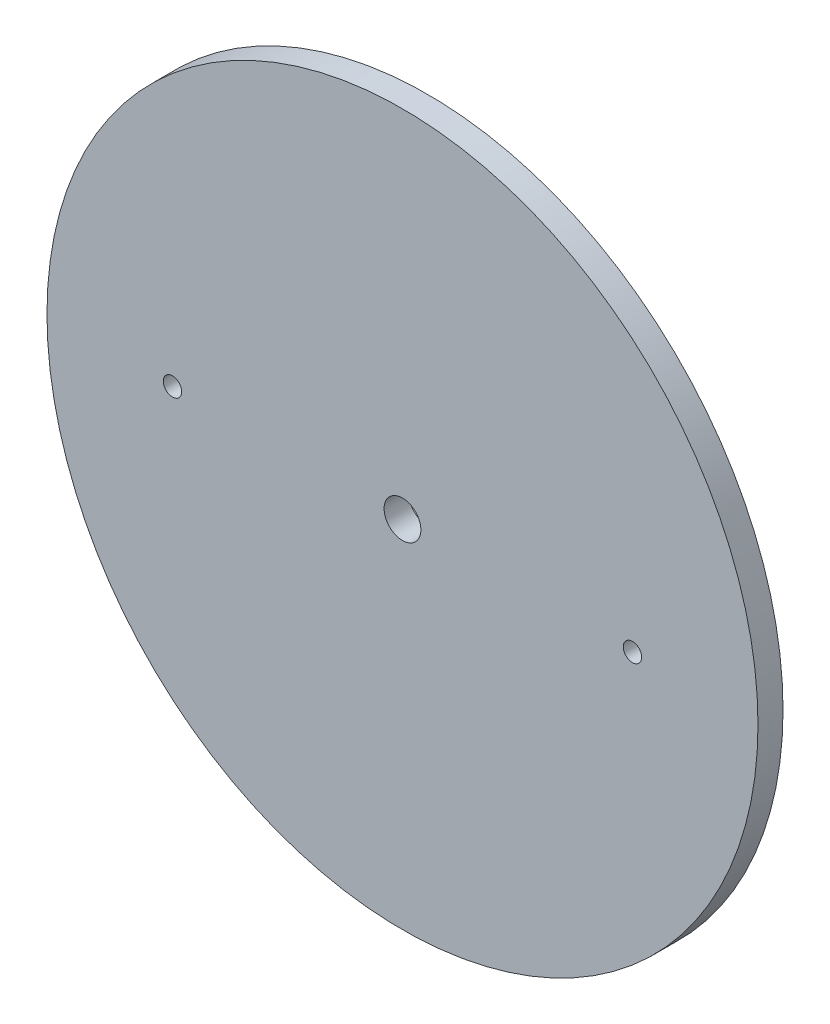
ISO-10303-21;
HEADER;
FILE_DESCRIPTION(('STEP AP214'),'2;1');
FILE_NAME('part.step','',(''),(''),'','','');
FILE_SCHEMA(('AUTOMOTIVE_DESIGN { 1 0 10303 214 1 1 1 1 }'));
ENDSEC;
DATA;
#1=APPLICATION_CONTEXT('core data for automotive mechanical design processes');
#2=APPLICATION_PROTOCOL_DEFINITION('international standard','automotive_design',2000,#1);
#3=PRODUCT_CONTEXT('',#1,'mechanical');
#4=PRODUCT('Part','Part','',(#3));
#5=PRODUCT_RELATED_PRODUCT_CATEGORY('part','',(#4));
#6=PRODUCT_DEFINITION_FORMATION('','',#4);
#7=PRODUCT_DEFINITION_CONTEXT('part definition',#1,'design');
#8=PRODUCT_DEFINITION('design','',#6,#7);
#9=PRODUCT_DEFINITION_SHAPE('','',#8);
#10=(LENGTH_UNIT() NAMED_UNIT(*) SI_UNIT(.MILLI.,.METRE.));
#11=(NAMED_UNIT(*) PLANE_ANGLE_UNIT() SI_UNIT($,.RADIAN.));
#12=(NAMED_UNIT(*) SI_UNIT($,.STERADIAN.) SOLID_ANGLE_UNIT());
#13=UNCERTAINTY_MEASURE_WITH_UNIT(LENGTH_MEASURE(1.E-05),#10,'distance_accuracy_value','');
#14=(GEOMETRIC_REPRESENTATION_CONTEXT(3) GLOBAL_UNCERTAINTY_ASSIGNED_CONTEXT((#13)) GLOBAL_UNIT_ASSIGNED_CONTEXT((#10,
#11,#12)) REPRESENTATION_CONTEXT('',''));
#15=CARTESIAN_POINT('',(0.,0.,0.));
#16=DIRECTION('',(0.,0.,1.));
#17=DIRECTION('',(1.,0.,0.));
#18=AXIS2_PLACEMENT_3D('',#15,#16,#17);
#19=CARTESIAN_POINT('',(0.,0.,0.));
#20=DIRECTION('',(0.,0.,-1.));
#21=DIRECTION('',(-1.,0.,0.));
#22=AXIS2_PLACEMENT_3D('',#19,#20,#21);
#23=CYLINDRICAL_SURFACE('',#22,71.);
#24=CARTESIAN_POINT('',(0.,0.,0.));
#25=DIRECTION('',(0.,0.,-1.));
#26=DIRECTION('',(1.,0.,0.));
#27=AXIS2_PLACEMENT_3D('',#24,#25,#26);
#28=CIRCLE('',#27,71.);
#29=CARTESIAN_POINT('',(71.,0.,0.));
#30=VERTEX_POINT('',#29);
#31=EDGE_CURVE('E10',#30,#30,#28,.T.);
#32=ORIENTED_EDGE('',*,*,#31,.T.);
#33=EDGE_LOOP('',(#32));
#34=FACE_BOUND('',#33,.T.);
#35=CARTESIAN_POINT('',(0.,0.,-5.));
#36=DIRECTION('',(0.,0.,-1.));
#37=DIRECTION('',(1.,0.,0.));
#38=AXIS2_PLACEMENT_3D('',#35,#36,#37);
#39=CIRCLE('',#38,71.);
#40=CARTESIAN_POINT('',(71.,0.,-5.));
#41=VERTEX_POINT('',#40);
#42=EDGE_CURVE('E40',#41,#41,#39,.T.);
#43=ORIENTED_EDGE('',*,*,#42,.F.);
#44=EDGE_LOOP('',(#43));
#45=FACE_BOUND('',#44,.T.);
#46=ADVANCED_FACE('F37',(#34,#45),#23,.T.);
#47=CARTESIAN_POINT('',(0.,0.,0.));
#48=DIRECTION('',(0.,0.,1.));
#49=DIRECTION('',(1.,0.,0.));
#50=AXIS2_PLACEMENT_3D('',#47,#48,#49);
#51=PLANE('',#50);
#52=CARTESIAN_POINT('',(0.,0.,0.));
#53=DIRECTION('',(0.,0.,-1.));
#54=DIRECTION('',(1.,0.,0.));
#55=AXIS2_PLACEMENT_3D('',#52,#53,#54);
#56=CIRCLE('',#55,3.6745406824147);
#57=CARTESIAN_POINT('',(3.6745406824147,0.,0.));
#58=VERTEX_POINT('',#57);
#59=EDGE_CURVE('E63',#58,#58,#56,.T.);
#60=ORIENTED_EDGE('',*,*,#59,.T.);
#61=EDGE_LOOP('',(#60));
#62=FACE_BOUND('',#61,.T.);
#63=CARTESIAN_POINT('',(45.9317585301837,0.,0.));
#64=DIRECTION('',(0.,0.,-1.));
#65=DIRECTION('',(1.,0.,0.));
#66=AXIS2_PLACEMENT_3D('',#63,#64,#65);
#67=CIRCLE('',#66,1.83727034120735);
#68=CARTESIAN_POINT('',(47.7690288713911,0.,0.));
#69=VERTEX_POINT('',#68);
#70=EDGE_CURVE('E55',#69,#69,#67,.T.);
#71=ORIENTED_EDGE('',*,*,#70,.T.);
#72=EDGE_LOOP('',(#71));
#73=FACE_BOUND('',#72,.T.);
#74=CARTESIAN_POINT('',(-45.9317585301837,0.,0.));
#75=DIRECTION('',(0.,0.,-1.));
#76=DIRECTION('',(1.,0.,0.));
#77=AXIS2_PLACEMENT_3D('',#74,#75,#76);
#78=CIRCLE('',#77,1.83727034120735);
#79=CARTESIAN_POINT('',(-44.0944881889764,0.,0.));
#80=VERTEX_POINT('',#79);
#81=EDGE_CURVE('E49',#80,#80,#78,.T.);
#82=ORIENTED_EDGE('',*,*,#81,.T.);
#83=EDGE_LOOP('',(#82));
#84=FACE_BOUND('',#83,.T.);
#85=ORIENTED_EDGE('',*,*,#31,.F.);
#86=EDGE_LOOP('',(#85));
#87=FACE_BOUND('',#86,.T.);
#88=ADVANCED_FACE('F75',(#62,#73,#84,#87),#51,.T.);
#89=CARTESIAN_POINT('',(0.,0.,-5.));
#90=DIRECTION('',(0.,0.,1.));
#91=DIRECTION('',(1.,0.,0.));
#92=AXIS2_PLACEMENT_3D('',#89,#90,#91);
#93=PLANE('',#92);
#94=CARTESIAN_POINT('',(0.,0.,-5.));
#95=DIRECTION('',(0.,0.,-1.));
#96=DIRECTION('',(1.,0.,0.));
#97=AXIS2_PLACEMENT_3D('',#94,#95,#96);
#98=CIRCLE('',#97,3.6745406824147);
#99=CARTESIAN_POINT('',(3.6745406824147,0.,-5.));
#100=VERTEX_POINT('',#99);
#101=EDGE_CURVE('E67',#100,#100,#98,.T.);
#102=ORIENTED_EDGE('',*,*,#101,.F.);
#103=EDGE_LOOP('',(#102));
#104=FACE_BOUND('',#103,.T.);
#105=CARTESIAN_POINT('',(45.9317585301837,0.,-5.));
#106=DIRECTION('',(0.,0.,-1.));
#107=DIRECTION('',(1.,0.,0.));
#108=AXIS2_PLACEMENT_3D('',#105,#106,#107);
#109=CIRCLE('',#108,1.83727034120735);
#110=CARTESIAN_POINT('',(47.7690288713911,0.,-5.));
#111=VERTEX_POINT('',#110);
#112=EDGE_CURVE('E59',#111,#111,#109,.T.);
#113=ORIENTED_EDGE('',*,*,#112,.F.);
#114=EDGE_LOOP('',(#113));
#115=FACE_BOUND('',#114,.T.);
#116=CARTESIAN_POINT('',(-45.9317585301837,0.,-5.));
#117=DIRECTION('',(0.,0.,-1.));
#118=DIRECTION('',(1.,0.,0.));
#119=AXIS2_PLACEMENT_3D('',#116,#117,#118);
#120=CIRCLE('',#119,1.83727034120735);
#121=CARTESIAN_POINT('',(-44.0944881889764,0.,-5.));
#122=VERTEX_POINT('',#121);
#123=EDGE_CURVE('E51',#122,#122,#120,.T.);
#124=ORIENTED_EDGE('',*,*,#123,.F.);
#125=EDGE_LOOP('',(#124));
#126=FACE_BOUND('',#125,.T.);
#127=ORIENTED_EDGE('',*,*,#42,.T.);
#128=EDGE_LOOP('',(#127));
#129=FACE_BOUND('',#128,.T.);
#130=ADVANCED_FACE('F85',(#104,#115,#126,#129),#93,.F.);
#131=CARTESIAN_POINT('',(-45.9317585301837,0.,0.));
#132=DIRECTION('',(0.,0.,-1.));
#133=DIRECTION('',(-1.,0.,0.));
#134=AXIS2_PLACEMENT_3D('',#131,#132,#133);
#135=CYLINDRICAL_SURFACE('',#134,1.83727034120735);
#136=ORIENTED_EDGE('',*,*,#81,.F.);
#137=EDGE_LOOP('',(#136));
#138=FACE_BOUND('',#137,.T.);
#139=ORIENTED_EDGE('',*,*,#123,.T.);
#140=EDGE_LOOP('',(#139));
#141=FACE_BOUND('',#140,.T.);
#142=ADVANCED_FACE('F88',(#138,#141),#135,.F.);
#143=CARTESIAN_POINT('',(45.9317585301837,0.,0.));
#144=DIRECTION('',(0.,0.,-1.));
#145=DIRECTION('',(-1.,0.,0.));
#146=AXIS2_PLACEMENT_3D('',#143,#144,#145);
#147=CYLINDRICAL_SURFACE('',#146,1.83727034120735);
#148=ORIENTED_EDGE('',*,*,#70,.F.);
#149=EDGE_LOOP('',(#148));
#150=FACE_BOUND('',#149,.T.);
#151=ORIENTED_EDGE('',*,*,#112,.T.);
#152=EDGE_LOOP('',(#151));
#153=FACE_BOUND('',#152,.T.);
#154=ADVANCED_FACE('F81',(#150,#153),#147,.F.);
#155=CARTESIAN_POINT('',(0.,0.,0.));
#156=DIRECTION('',(0.,0.,-1.));
#157=DIRECTION('',(-1.,0.,0.));
#158=AXIS2_PLACEMENT_3D('',#155,#156,#157);
#159=CYLINDRICAL_SURFACE('',#158,3.6745406824147);
#160=ORIENTED_EDGE('',*,*,#59,.F.);
#161=EDGE_LOOP('',(#160));
#162=FACE_BOUND('',#161,.T.);
#163=ORIENTED_EDGE('',*,*,#101,.T.);
#164=EDGE_LOOP('',(#163));
#165=FACE_BOUND('',#164,.T.);
#166=ADVANCED_FACE('F78',(#162,#165),#159,.F.);
#167=CLOSED_SHELL('',(#46,#88,#130,#142,#154,#166));
#168=MANIFOLD_SOLID_BREP('B2',#167);
#169=ADVANCED_BREP_SHAPE_REPRESENTATION('',(#18,#168),#14);
#170=SHAPE_DEFINITION_REPRESENTATION(#9,#169);
ENDSEC;
END-ISO-10303-21;
